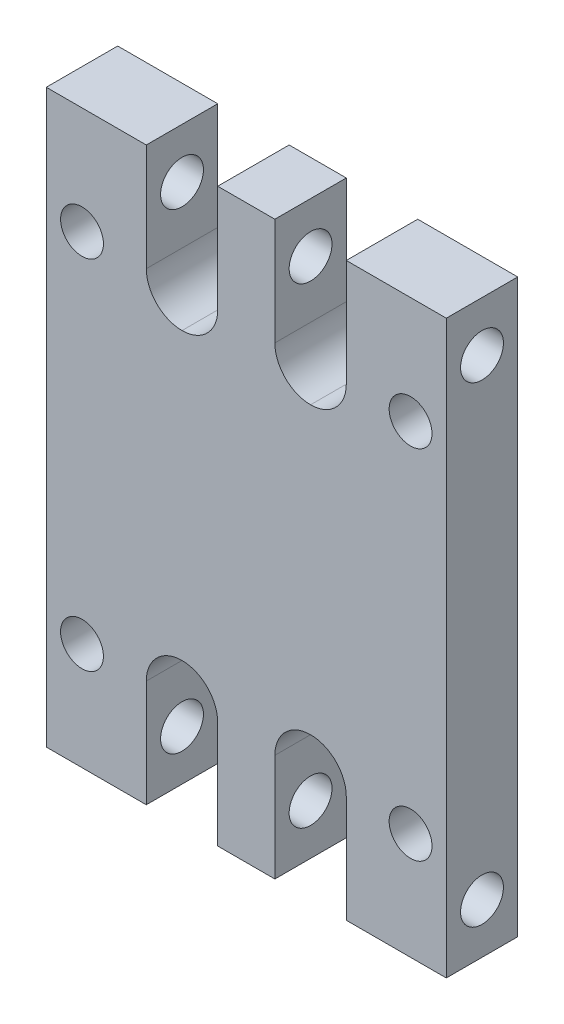
ISO-10303-21;
HEADER;
FILE_DESCRIPTION(('STEP AP214'),'2;1');
FILE_NAME('part.step','',(''),(''),'','','');
FILE_SCHEMA(('AUTOMOTIVE_DESIGN { 1 0 10303 214 1 1 1 1 }'));
ENDSEC;
DATA;
#1=APPLICATION_CONTEXT('core data for automotive mechanical design processes');
#2=APPLICATION_PROTOCOL_DEFINITION('international standard','automotive_design',2000,#1);
#3=PRODUCT_CONTEXT('',#1,'mechanical');
#4=PRODUCT('Part','Part','',(#3));
#5=PRODUCT_RELATED_PRODUCT_CATEGORY('part','',(#4));
#6=PRODUCT_DEFINITION_FORMATION('','',#4);
#7=PRODUCT_DEFINITION_CONTEXT('part definition',#1,'design');
#8=PRODUCT_DEFINITION('design','',#6,#7);
#9=PRODUCT_DEFINITION_SHAPE('','',#8);
#10=(LENGTH_UNIT() NAMED_UNIT(*) SI_UNIT(.MILLI.,.METRE.));
#11=(NAMED_UNIT(*) PLANE_ANGLE_UNIT() SI_UNIT($,.RADIAN.));
#12=(NAMED_UNIT(*) SI_UNIT($,.STERADIAN.) SOLID_ANGLE_UNIT());
#13=UNCERTAINTY_MEASURE_WITH_UNIT(LENGTH_MEASURE(1.E-05),#10,'distance_accuracy_value','');
#14=(GEOMETRIC_REPRESENTATION_CONTEXT(3) GLOBAL_UNCERTAINTY_ASSIGNED_CONTEXT((#13)) GLOBAL_UNIT_ASSIGNED_CONTEXT((#10,
#11,#12)) REPRESENTATION_CONTEXT('',''));
#15=CARTESIAN_POINT('',(0.,0.,0.));
#16=DIRECTION('',(0.,0.,1.));
#17=DIRECTION('',(1.,0.,0.));
#18=AXIS2_PLACEMENT_3D('',#15,#16,#17);
#19=CARTESIAN_POINT('',(0.,0.,5.));
#20=DIRECTION('',(0.,0.,1.));
#21=DIRECTION('',(1.,0.,0.));
#22=AXIS2_PLACEMENT_3D('',#19,#20,#21);
#23=PLANE('',#22);
#24=CARTESIAN_POINT('',(-11.5,12.5,5.));
#25=DIRECTION('',(0.,0.,1.));
#26=DIRECTION('',(1.,0.,0.));
#27=AXIS2_PLACEMENT_3D('',#24,#25,#26);
#28=CIRCLE('',#27,1.5);
#29=CARTESIAN_POINT('',(-10.,12.5,5.));
#30=VERTEX_POINT('',#29);
#31=EDGE_CURVE('E305',#30,#30,#28,.T.);
#32=ORIENTED_EDGE('',*,*,#31,.F.);
#33=EDGE_LOOP('',(#32));
#34=FACE_BOUND('',#33,.T.);
#35=CARTESIAN_POINT('',(11.5,12.5,5.));
#36=DIRECTION('',(0.,0.,1.));
#37=DIRECTION('',(-1.,0.,0.));
#38=AXIS2_PLACEMENT_3D('',#35,#36,#37);
#39=CIRCLE('',#38,1.5);
#40=CARTESIAN_POINT('',(10.,12.5,5.));
#41=VERTEX_POINT('',#40);
#42=EDGE_CURVE('E317',#41,#41,#39,.T.);
#43=ORIENTED_EDGE('',*,*,#42,.F.);
#44=EDGE_LOOP('',(#43));
#45=FACE_BOUND('',#44,.T.);
#46=DIRECTION('',(-1.,0.,0.));
#47=VECTOR('',#46,1.);
#48=CARTESIAN_POINT('',(7.,20.,5.));
#49=LINE('',#48,#47);
#50=CARTESIAN_POINT('',(14.,20.,5.));
#51=VERTEX_POINT('',#50);
#52=CARTESIAN_POINT('',(7.,20.,5.));
#53=VERTEX_POINT('',#52);
#54=EDGE_CURVE('E207',#51,#53,#49,.T.);
#55=ORIENTED_EDGE('',*,*,#54,.T.);
#56=DIRECTION('',(0.,-1.,0.));
#57=VECTOR('',#56,1.);
#58=CARTESIAN_POINT('',(7.,20.,5.));
#59=LINE('',#58,#57);
#60=CARTESIAN_POINT('',(7.,12.5,5.));
#61=VERTEX_POINT('',#60);
#62=EDGE_CURVE('E197',#53,#61,#59,.T.);
#63=ORIENTED_EDGE('',*,*,#62,.T.);
#64=CARTESIAN_POINT('',(4.5,12.5,5.));
#65=DIRECTION('',(0.,0.,1.));
#66=DIRECTION('',(1.,0.,0.));
#67=AXIS2_PLACEMENT_3D('',#64,#65,#66);
#68=CIRCLE('',#67,2.5);
#69=CARTESIAN_POINT('',(4.5,10.,5.));
#70=VERTEX_POINT('',#69);
#71=EDGE_CURVE('E264',#61,#70,#68,.F.);
#72=ORIENTED_EDGE('',*,*,#71,.T.);
#73=CARTESIAN_POINT('',(4.5,12.5,5.));
#74=DIRECTION('',(0.,0.,1.));
#75=DIRECTION('',(1.,0.,0.));
#76=AXIS2_PLACEMENT_3D('',#73,#74,#75);
#77=CIRCLE('',#76,2.5);
#78=CARTESIAN_POINT('',(2.,12.5,5.));
#79=VERTEX_POINT('',#78);
#80=EDGE_CURVE('E268',#70,#79,#77,.F.);
#81=ORIENTED_EDGE('',*,*,#80,.T.);
#82=DIRECTION('',(0.,1.,0.));
#83=VECTOR('',#82,1.);
#84=CARTESIAN_POINT('',(2.,20.,5.));
#85=LINE('',#84,#83);
#86=CARTESIAN_POINT('',(2.,20.,5.));
#87=VERTEX_POINT('',#86);
#88=EDGE_CURVE('E206',#79,#87,#85,.T.);
#89=ORIENTED_EDGE('',*,*,#88,.T.);
#90=DIRECTION('',(-1.,0.,0.));
#91=VECTOR('',#90,1.);
#92=CARTESIAN_POINT('',(-2.,20.,5.));
#93=LINE('',#92,#91);
#94=CARTESIAN_POINT('',(-2.,20.,5.));
#95=VERTEX_POINT('',#94);
#96=EDGE_CURVE('E323',#87,#95,#93,.T.);
#97=ORIENTED_EDGE('',*,*,#96,.T.);
#98=DIRECTION('',(0.,-1.,0.));
#99=VECTOR('',#98,1.);
#100=CARTESIAN_POINT('',(-2.,20.,5.));
#101=LINE('',#100,#99);
#102=CARTESIAN_POINT('',(-2.,12.5,5.));
#103=VERTEX_POINT('',#102);
#104=EDGE_CURVE('E325',#95,#103,#101,.T.);
#105=ORIENTED_EDGE('',*,*,#104,.T.);
#106=CARTESIAN_POINT('',(-4.5,12.5,5.));
#107=DIRECTION('',(0.,0.,1.));
#108=DIRECTION('',(1.,0.,0.));
#109=AXIS2_PLACEMENT_3D('',#106,#107,#108);
#110=CIRCLE('',#109,2.5);
#111=CARTESIAN_POINT('',(-4.5,10.,5.));
#112=VERTEX_POINT('',#111);
#113=EDGE_CURVE('E50',#103,#112,#110,.F.);
#114=ORIENTED_EDGE('',*,*,#113,.T.);
#115=CARTESIAN_POINT('',(-4.5,12.5,5.));
#116=DIRECTION('',(0.,0.,1.));
#117=DIRECTION('',(1.,0.,0.));
#118=AXIS2_PLACEMENT_3D('',#115,#116,#117);
#119=CIRCLE('',#118,2.5);
#120=CARTESIAN_POINT('',(-7.,12.5,5.));
#121=VERTEX_POINT('',#120);
#122=EDGE_CURVE('E11',#112,#121,#119,.F.);
#123=ORIENTED_EDGE('',*,*,#122,.T.);
#124=DIRECTION('',(0.,1.,0.));
#125=VECTOR('',#124,1.);
#126=CARTESIAN_POINT('',(-7.,20.,5.));
#127=LINE('',#126,#125);
#128=CARTESIAN_POINT('',(-7.,20.,5.));
#129=VERTEX_POINT('',#128);
#130=EDGE_CURVE('E327',#121,#129,#127,.T.);
#131=ORIENTED_EDGE('',*,*,#130,.T.);
#132=DIRECTION('',(-1.,0.,0.));
#133=VECTOR('',#132,1.);
#134=CARTESIAN_POINT('',(-14.,20.,5.));
#135=LINE('',#134,#133);
#136=CARTESIAN_POINT('',(-14.,20.,5.));
#137=VERTEX_POINT('',#136);
#138=EDGE_CURVE('E329',#129,#137,#135,.T.);
#139=ORIENTED_EDGE('',*,*,#138,.T.);
#140=DIRECTION('',(0.,-1.,0.));
#141=VECTOR('',#140,1.);
#142=CARTESIAN_POINT('',(-14.,-20.,5.));
#143=LINE('',#142,#141);
#144=CARTESIAN_POINT('',(-14.,-20.,5.));
#145=VERTEX_POINT('',#144);
#146=EDGE_CURVE('E331',#137,#145,#143,.T.);
#147=ORIENTED_EDGE('',*,*,#146,.T.);
#148=DIRECTION('',(1.,0.,0.));
#149=VECTOR('',#148,1.);
#150=CARTESIAN_POINT('',(-14.,-20.,5.));
#151=LINE('',#150,#149);
#152=CARTESIAN_POINT('',(-6.99999999999999,-20.,5.));
#153=VERTEX_POINT('',#152);
#154=EDGE_CURVE('E333',#145,#153,#151,.T.);
#155=ORIENTED_EDGE('',*,*,#154,.T.);
#156=DIRECTION('',(0.,1.,0.));
#157=VECTOR('',#156,1.);
#158=CARTESIAN_POINT('',(-6.99999999999999,-20.,5.));
#159=LINE('',#158,#157);
#160=CARTESIAN_POINT('',(-7.,-12.5,5.));
#161=VERTEX_POINT('',#160);
#162=EDGE_CURVE('E335',#153,#161,#159,.T.);
#163=ORIENTED_EDGE('',*,*,#162,.T.);
#164=CARTESIAN_POINT('',(-4.5,-12.5,5.));
#165=DIRECTION('',(0.,0.,1.));
#166=DIRECTION('',(1.,0.,0.));
#167=AXIS2_PLACEMENT_3D('',#164,#165,#166);
#168=CIRCLE('',#167,2.5);
#169=CARTESIAN_POINT('',(-4.5,-10.,5.));
#170=VERTEX_POINT('',#169);
#171=EDGE_CURVE('E260',#161,#170,#168,.F.);
#172=ORIENTED_EDGE('',*,*,#171,.T.);
#173=CARTESIAN_POINT('',(-4.5,-12.5,5.));
#174=DIRECTION('',(0.,0.,1.));
#175=DIRECTION('',(1.,0.,0.));
#176=AXIS2_PLACEMENT_3D('',#173,#174,#175);
#177=CIRCLE('',#176,2.5);
#178=CARTESIAN_POINT('',(-2.,-12.5,5.));
#179=VERTEX_POINT('',#178);
#180=EDGE_CURVE('E256',#170,#179,#177,.F.);
#181=ORIENTED_EDGE('',*,*,#180,.T.);
#182=DIRECTION('',(0.,-1.,0.));
#183=VECTOR('',#182,1.);
#184=CARTESIAN_POINT('',(-2.,-20.,5.));
#185=LINE('',#184,#183);
#186=CARTESIAN_POINT('',(-2.,-20.,5.));
#187=VERTEX_POINT('',#186);
#188=EDGE_CURVE('E338',#179,#187,#185,.T.);
#189=ORIENTED_EDGE('',*,*,#188,.T.);
#190=DIRECTION('',(1.,0.,0.));
#191=VECTOR('',#190,1.);
#192=CARTESIAN_POINT('',(-2.,-20.,5.));
#193=LINE('',#192,#191);
#194=CARTESIAN_POINT('',(2.00000000000001,-20.,5.));
#195=VERTEX_POINT('',#194);
#196=EDGE_CURVE('E340',#187,#195,#193,.T.);
#197=ORIENTED_EDGE('',*,*,#196,.T.);
#198=DIRECTION('',(0.,1.,0.));
#199=VECTOR('',#198,1.);
#200=CARTESIAN_POINT('',(2.00000000000001,-20.,5.));
#201=LINE('',#200,#199);
#202=CARTESIAN_POINT('',(2.,-12.5,5.));
#203=VERTEX_POINT('',#202);
#204=EDGE_CURVE('E342',#195,#203,#201,.T.);
#205=ORIENTED_EDGE('',*,*,#204,.T.);
#206=CARTESIAN_POINT('',(4.5,-12.5,5.));
#207=DIRECTION('',(0.,0.,1.));
#208=DIRECTION('',(1.,0.,0.));
#209=AXIS2_PLACEMENT_3D('',#206,#207,#208);
#210=CIRCLE('',#209,2.5);
#211=CARTESIAN_POINT('',(4.5,-10.,5.));
#212=VERTEX_POINT('',#211);
#213=EDGE_CURVE('E252',#203,#212,#210,.F.);
#214=ORIENTED_EDGE('',*,*,#213,.T.);
#215=CARTESIAN_POINT('',(4.5,-12.5,5.));
#216=DIRECTION('',(0.,0.,1.));
#217=DIRECTION('',(1.,0.,0.));
#218=AXIS2_PLACEMENT_3D('',#215,#216,#217);
#219=CIRCLE('',#218,2.5);
#220=CARTESIAN_POINT('',(7.,-12.5,5.));
#221=VERTEX_POINT('',#220);
#222=EDGE_CURVE('E248',#212,#221,#219,.F.);
#223=ORIENTED_EDGE('',*,*,#222,.T.);
#224=DIRECTION('',(0.,-1.,0.));
#225=VECTOR('',#224,1.);
#226=CARTESIAN_POINT('',(7.00000000000001,-20.,5.));
#227=LINE('',#226,#225);
#228=CARTESIAN_POINT('',(7.00000000000001,-20.,5.));
#229=VERTEX_POINT('',#228);
#230=EDGE_CURVE('E345',#221,#229,#227,.T.);
#231=ORIENTED_EDGE('',*,*,#230,.T.);
#232=DIRECTION('',(1.,0.,0.));
#233=VECTOR('',#232,1.);
#234=CARTESIAN_POINT('',(7.00000000000001,-20.,5.));
#235=LINE('',#234,#233);
#236=CARTESIAN_POINT('',(14.,-20.,5.));
#237=VERTEX_POINT('',#236);
#238=EDGE_CURVE('E347',#229,#237,#235,.T.);
#239=ORIENTED_EDGE('',*,*,#238,.T.);
#240=DIRECTION('',(0.,1.,0.));
#241=VECTOR('',#240,1.);
#242=CARTESIAN_POINT('',(14.,-20.,5.));
#243=LINE('',#242,#241);
#244=EDGE_CURVE('E212',#237,#51,#243,.T.);
#245=ORIENTED_EDGE('',*,*,#244,.T.);
#246=EDGE_LOOP('',(#55,#63,#72,#81,#89,#97,#105,#114,#123,#131,#139,#147,#155,#163,#172,#181,
#189,#197,#205,#214,#223,#231,#239,#245));
#247=FACE_BOUND('',#246,.T.);
#248=CARTESIAN_POINT('',(11.5,-12.5,5.));
#249=DIRECTION('',(0.,0.,1.));
#250=DIRECTION('',(1.,0.,0.));
#251=AXIS2_PLACEMENT_3D('',#248,#249,#250);
#252=CIRCLE('',#251,1.5);
#253=CARTESIAN_POINT('',(13.,-12.5,5.));
#254=VERTEX_POINT('',#253);
#255=EDGE_CURVE('E311',#254,#254,#252,.T.);
#256=ORIENTED_EDGE('',*,*,#255,.F.);
#257=EDGE_LOOP('',(#256));
#258=FACE_BOUND('',#257,.T.);
#259=CARTESIAN_POINT('',(-11.5,-12.5,5.));
#260=DIRECTION('',(0.,0.,1.));
#261=DIRECTION('',(-1.,0.,0.));
#262=AXIS2_PLACEMENT_3D('',#259,#260,#261);
#263=CIRCLE('',#262,1.5);
#264=CARTESIAN_POINT('',(-13.,-12.5,5.));
#265=VERTEX_POINT('',#264);
#266=EDGE_CURVE('E299',#265,#265,#263,.T.);
#267=ORIENTED_EDGE('',*,*,#266,.F.);
#268=EDGE_LOOP('',(#267));
#269=FACE_BOUND('',#268,.T.);
#270=ADVANCED_FACE('F34',(#34,#45,#247,#258,#269),#23,.T.);
#271=CARTESIAN_POINT('',(0.,0.,0.));
#272=DIRECTION('',(0.,0.,1.));
#273=DIRECTION('',(1.,0.,0.));
#274=AXIS2_PLACEMENT_3D('',#271,#272,#273);
#275=PLANE('',#274);
#276=DIRECTION('',(-1.,0.,0.));
#277=VECTOR('',#276,1.);
#278=CARTESIAN_POINT('',(7.,20.,0.));
#279=LINE('',#278,#277);
#280=CARTESIAN_POINT('',(14.,20.,0.));
#281=VERTEX_POINT('',#280);
#282=CARTESIAN_POINT('',(7.,20.,0.));
#283=VERTEX_POINT('',#282);
#284=EDGE_CURVE('E220',#281,#283,#279,.T.);
#285=ORIENTED_EDGE('',*,*,#284,.F.);
#286=DIRECTION('',(0.,1.,0.));
#287=VECTOR('',#286,1.);
#288=CARTESIAN_POINT('',(14.,-20.,0.));
#289=LINE('',#288,#287);
#290=CARTESIAN_POINT('',(14.,-20.,0.));
#291=VERTEX_POINT('',#290);
#292=EDGE_CURVE('E216',#291,#281,#289,.T.);
#293=ORIENTED_EDGE('',*,*,#292,.F.);
#294=DIRECTION('',(1.,0.,0.));
#295=VECTOR('',#294,1.);
#296=CARTESIAN_POINT('',(7.00000000000001,-20.,0.));
#297=LINE('',#296,#295);
#298=CARTESIAN_POINT('',(7.00000000000001,-20.,0.));
#299=VERTEX_POINT('',#298);
#300=EDGE_CURVE('E381',#299,#291,#297,.T.);
#301=ORIENTED_EDGE('',*,*,#300,.F.);
#302=DIRECTION('',(0.,-1.,0.));
#303=VECTOR('',#302,1.);
#304=CARTESIAN_POINT('',(7.00000000000001,-20.,0.));
#305=LINE('',#304,#303);
#306=CARTESIAN_POINT('',(7.,-12.5,0.));
#307=VERTEX_POINT('',#306);
#308=EDGE_CURVE('E379',#307,#299,#305,.T.);
#309=ORIENTED_EDGE('',*,*,#308,.F.);
#310=CARTESIAN_POINT('',(4.5,-12.5,0.));
#311=DIRECTION('',(0.,0.,1.));
#312=DIRECTION('',(1.,0.,0.));
#313=AXIS2_PLACEMENT_3D('',#310,#311,#312);
#314=CIRCLE('',#313,2.5);
#315=CARTESIAN_POINT('',(4.5,-10.,0.));
#316=VERTEX_POINT('',#315);
#317=EDGE_CURVE('E246',#307,#316,#314,.T.);
#318=ORIENTED_EDGE('',*,*,#317,.T.);
#319=CARTESIAN_POINT('',(4.5,-12.5,0.));
#320=DIRECTION('',(0.,0.,1.));
#321=DIRECTION('',(1.,0.,0.));
#322=AXIS2_PLACEMENT_3D('',#319,#320,#321);
#323=CIRCLE('',#322,2.5);
#324=CARTESIAN_POINT('',(2.,-12.5,0.));
#325=VERTEX_POINT('',#324);
#326=EDGE_CURVE('E250',#316,#325,#323,.T.);
#327=ORIENTED_EDGE('',*,*,#326,.T.);
#328=DIRECTION('',(0.,1.,0.));
#329=VECTOR('',#328,1.);
#330=CARTESIAN_POINT('',(2.00000000000001,-20.,0.));
#331=LINE('',#330,#329);
#332=CARTESIAN_POINT('',(2.00000000000001,-20.,0.));
#333=VERTEX_POINT('',#332);
#334=EDGE_CURVE('E376',#333,#325,#331,.T.);
#335=ORIENTED_EDGE('',*,*,#334,.F.);
#336=DIRECTION('',(1.,0.,0.));
#337=VECTOR('',#336,1.);
#338=CARTESIAN_POINT('',(-2.,-20.,0.));
#339=LINE('',#338,#337);
#340=CARTESIAN_POINT('',(-2.,-20.,0.));
#341=VERTEX_POINT('',#340);
#342=EDGE_CURVE('E374',#341,#333,#339,.T.);
#343=ORIENTED_EDGE('',*,*,#342,.F.);
#344=DIRECTION('',(0.,-1.,0.));
#345=VECTOR('',#344,1.);
#346=CARTESIAN_POINT('',(-2.,-20.,0.));
#347=LINE('',#346,#345);
#348=CARTESIAN_POINT('',(-2.,-12.5,0.));
#349=VERTEX_POINT('',#348);
#350=EDGE_CURVE('E372',#349,#341,#347,.T.);
#351=ORIENTED_EDGE('',*,*,#350,.F.);
#352=CARTESIAN_POINT('',(-4.5,-12.5,0.));
#353=DIRECTION('',(0.,0.,1.));
#354=DIRECTION('',(1.,0.,0.));
#355=AXIS2_PLACEMENT_3D('',#352,#353,#354);
#356=CIRCLE('',#355,2.5);
#357=CARTESIAN_POINT('',(-4.5,-10.,0.));
#358=VERTEX_POINT('',#357);
#359=EDGE_CURVE('E254',#349,#358,#356,.T.);
#360=ORIENTED_EDGE('',*,*,#359,.T.);
#361=CARTESIAN_POINT('',(-4.5,-12.5,0.));
#362=DIRECTION('',(0.,0.,1.));
#363=DIRECTION('',(1.,0.,0.));
#364=AXIS2_PLACEMENT_3D('',#361,#362,#363);
#365=CIRCLE('',#364,2.5);
#366=CARTESIAN_POINT('',(-7.,-12.5,0.));
#367=VERTEX_POINT('',#366);
#368=EDGE_CURVE('E258',#358,#367,#365,.T.);
#369=ORIENTED_EDGE('',*,*,#368,.T.);
#370=DIRECTION('',(0.,1.,0.));
#371=VECTOR('',#370,1.);
#372=CARTESIAN_POINT('',(-6.99999999999999,-20.,0.));
#373=LINE('',#372,#371);
#374=CARTESIAN_POINT('',(-6.99999999999999,-20.,0.));
#375=VERTEX_POINT('',#374);
#376=EDGE_CURVE('E369',#375,#367,#373,.T.);
#377=ORIENTED_EDGE('',*,*,#376,.F.);
#378=DIRECTION('',(1.,0.,0.));
#379=VECTOR('',#378,1.);
#380=CARTESIAN_POINT('',(-14.,-20.,0.));
#381=LINE('',#380,#379);
#382=CARTESIAN_POINT('',(-14.,-20.,0.));
#383=VERTEX_POINT('',#382);
#384=EDGE_CURVE('E367',#383,#375,#381,.T.);
#385=ORIENTED_EDGE('',*,*,#384,.F.);
#386=DIRECTION('',(0.,-1.,0.));
#387=VECTOR('',#386,1.);
#388=CARTESIAN_POINT('',(-14.,-20.,0.));
#389=LINE('',#388,#387);
#390=CARTESIAN_POINT('',(-14.,20.,0.));
#391=VERTEX_POINT('',#390);
#392=EDGE_CURVE('E365',#391,#383,#389,.T.);
#393=ORIENTED_EDGE('',*,*,#392,.F.);
#394=DIRECTION('',(-1.,0.,0.));
#395=VECTOR('',#394,1.);
#396=CARTESIAN_POINT('',(-14.,20.,0.));
#397=LINE('',#396,#395);
#398=CARTESIAN_POINT('',(-7.,20.,0.));
#399=VERTEX_POINT('',#398);
#400=EDGE_CURVE('E363',#399,#391,#397,.T.);
#401=ORIENTED_EDGE('',*,*,#400,.F.);
#402=DIRECTION('',(0.,1.,0.));
#403=VECTOR('',#402,1.);
#404=CARTESIAN_POINT('',(-7.,20.,0.));
#405=LINE('',#404,#403);
#406=CARTESIAN_POINT('',(-7.,12.5,0.));
#407=VERTEX_POINT('',#406);
#408=EDGE_CURVE('E361',#407,#399,#405,.T.);
#409=ORIENTED_EDGE('',*,*,#408,.F.);
#410=CARTESIAN_POINT('',(-4.5,12.5,0.));
#411=DIRECTION('',(0.,0.,1.));
#412=DIRECTION('',(1.,0.,0.));
#413=AXIS2_PLACEMENT_3D('',#410,#411,#412);
#414=CIRCLE('',#413,2.5);
#415=CARTESIAN_POINT('',(-4.5,10.,0.));
#416=VERTEX_POINT('',#415);
#417=EDGE_CURVE('E43',#407,#416,#414,.T.);
#418=ORIENTED_EDGE('',*,*,#417,.T.);
#419=CARTESIAN_POINT('',(-4.5,12.5,0.));
#420=DIRECTION('',(0.,0.,1.));
#421=DIRECTION('',(1.,0.,0.));
#422=AXIS2_PLACEMENT_3D('',#419,#420,#421);
#423=CIRCLE('',#422,2.5);
#424=CARTESIAN_POINT('',(-2.,12.5,0.));
#425=VERTEX_POINT('',#424);
#426=EDGE_CURVE('E270',#416,#425,#423,.T.);
#427=ORIENTED_EDGE('',*,*,#426,.T.);
#428=DIRECTION('',(0.,-1.,0.));
#429=VECTOR('',#428,1.);
#430=CARTESIAN_POINT('',(-2.,20.,0.));
#431=LINE('',#430,#429);
#432=CARTESIAN_POINT('',(-2.,20.,0.));
#433=VERTEX_POINT('',#432);
#434=EDGE_CURVE('E358',#433,#425,#431,.T.);
#435=ORIENTED_EDGE('',*,*,#434,.F.);
#436=DIRECTION('',(-1.,0.,0.));
#437=VECTOR('',#436,1.);
#438=CARTESIAN_POINT('',(-2.,20.,0.));
#439=LINE('',#438,#437);
#440=CARTESIAN_POINT('',(2.,20.,0.));
#441=VERTEX_POINT('',#440);
#442=EDGE_CURVE('E356',#441,#433,#439,.T.);
#443=ORIENTED_EDGE('',*,*,#442,.F.);
#444=DIRECTION('',(0.,1.,0.));
#445=VECTOR('',#444,1.);
#446=CARTESIAN_POINT('',(2.,20.,0.));
#447=LINE('',#446,#445);
#448=CARTESIAN_POINT('',(2.,12.5,0.));
#449=VERTEX_POINT('',#448);
#450=EDGE_CURVE('E354',#449,#441,#447,.T.);
#451=ORIENTED_EDGE('',*,*,#450,.F.);
#452=CARTESIAN_POINT('',(4.5,12.5,0.));
#453=DIRECTION('',(0.,0.,1.));
#454=DIRECTION('',(1.,0.,0.));
#455=AXIS2_PLACEMENT_3D('',#452,#453,#454);
#456=CIRCLE('',#455,2.5);
#457=CARTESIAN_POINT('',(4.5,10.,0.));
#458=VERTEX_POINT('',#457);
#459=EDGE_CURVE('E266',#449,#458,#456,.T.);
#460=ORIENTED_EDGE('',*,*,#459,.T.);
#461=CARTESIAN_POINT('',(4.5,12.5,0.));
#462=DIRECTION('',(0.,0.,1.));
#463=DIRECTION('',(1.,0.,0.));
#464=AXIS2_PLACEMENT_3D('',#461,#462,#463);
#465=CIRCLE('',#464,2.5);
#466=CARTESIAN_POINT('',(7.,12.5,0.));
#467=VERTEX_POINT('',#466);
#468=EDGE_CURVE('E262',#458,#467,#465,.T.);
#469=ORIENTED_EDGE('',*,*,#468,.T.);
#470=DIRECTION('',(0.,-1.,0.));
#471=VECTOR('',#470,1.);
#472=CARTESIAN_POINT('',(7.,20.,0.));
#473=LINE('',#472,#471);
#474=EDGE_CURVE('E352',#283,#467,#473,.T.);
#475=ORIENTED_EDGE('',*,*,#474,.F.);
#476=EDGE_LOOP('',(#285,#293,#301,#309,#318,#327,#335,#343,#351,#360,#369,#377,#385,#393,#401,
#409,#418,#427,#435,#443,#451,#460,#469,#475));
#477=FACE_BOUND('',#476,.T.);
#478=CARTESIAN_POINT('',(11.5,12.5,0.));
#479=DIRECTION('',(0.,0.,1.));
#480=DIRECTION('',(-1.,0.,0.));
#481=AXIS2_PLACEMENT_3D('',#478,#479,#480);
#482=CIRCLE('',#481,1.5);
#483=CARTESIAN_POINT('',(10.,12.5,0.));
#484=VERTEX_POINT('',#483);
#485=EDGE_CURVE('E314',#484,#484,#482,.T.);
#486=ORIENTED_EDGE('',*,*,#485,.T.);
#487=EDGE_LOOP('',(#486));
#488=FACE_BOUND('',#487,.T.);
#489=CARTESIAN_POINT('',(11.5,-12.5,0.));
#490=DIRECTION('',(0.,0.,1.));
#491=DIRECTION('',(1.,0.,0.));
#492=AXIS2_PLACEMENT_3D('',#489,#490,#491);
#493=CIRCLE('',#492,1.5);
#494=CARTESIAN_POINT('',(13.,-12.5,0.));
#495=VERTEX_POINT('',#494);
#496=EDGE_CURVE('E308',#495,#495,#493,.T.);
#497=ORIENTED_EDGE('',*,*,#496,.T.);
#498=EDGE_LOOP('',(#497));
#499=FACE_BOUND('',#498,.T.);
#500=CARTESIAN_POINT('',(-11.5,12.5,0.));
#501=DIRECTION('',(0.,0.,1.));
#502=DIRECTION('',(1.,0.,0.));
#503=AXIS2_PLACEMENT_3D('',#500,#501,#502);
#504=CIRCLE('',#503,1.5);
#505=CARTESIAN_POINT('',(-10.,12.5,0.));
#506=VERTEX_POINT('',#505);
#507=EDGE_CURVE('E302',#506,#506,#504,.T.);
#508=ORIENTED_EDGE('',*,*,#507,.T.);
#509=EDGE_LOOP('',(#508));
#510=FACE_BOUND('',#509,.T.);
#511=CARTESIAN_POINT('',(-11.5,-12.5,0.));
#512=DIRECTION('',(0.,0.,1.));
#513=DIRECTION('',(-1.,0.,0.));
#514=AXIS2_PLACEMENT_3D('',#511,#512,#513);
#515=CIRCLE('',#514,1.5);
#516=CARTESIAN_POINT('',(-13.,-12.5,0.));
#517=VERTEX_POINT('',#516);
#518=EDGE_CURVE('E277',#517,#517,#515,.T.);
#519=ORIENTED_EDGE('',*,*,#518,.T.);
#520=EDGE_LOOP('',(#519));
#521=FACE_BOUND('',#520,.T.);
#522=ADVANCED_FACE('F418',(#477,#488,#499,#510,#521),#275,.F.);
#523=CARTESIAN_POINT('',(7.,20.,5.));
#524=DIRECTION('',(0.,-1.,0.));
#525=DIRECTION('',(1.,0.,0.));
#526=AXIS2_PLACEMENT_3D('',#523,#524,#525);
#527=PLANE('',#526);
#528=ORIENTED_EDGE('',*,*,#284,.T.);
#529=DIRECTION('',(0.,0.,-1.));
#530=VECTOR('',#529,1.);
#531=CARTESIAN_POINT('',(7.,20.,5.));
#532=LINE('',#531,#530);
#533=EDGE_CURVE('E202',#53,#283,#532,.T.);
#534=ORIENTED_EDGE('',*,*,#533,.F.);
#535=ORIENTED_EDGE('',*,*,#54,.F.);
#536=DIRECTION('',(0.,0.,-1.));
#537=VECTOR('',#536,1.);
#538=CARTESIAN_POINT('',(14.,20.,5.));
#539=LINE('',#538,#537);
#540=EDGE_CURVE('E350',#51,#281,#539,.T.);
#541=ORIENTED_EDGE('',*,*,#540,.T.);
#542=EDGE_LOOP('',(#528,#534,#535,#541));
#543=FACE_BOUND('',#542,.T.);
#544=ADVANCED_FACE('F218',(#543),#527,.F.);
#545=CARTESIAN_POINT('',(7.,20.,5.));
#546=DIRECTION('',(1.,0.,0.));
#547=DIRECTION('',(0.,1.,0.));
#548=AXIS2_PLACEMENT_3D('',#545,#546,#547);
#549=PLANE('',#548);
#550=CARTESIAN_POINT('',(7.,16.5,2.5));
#551=DIRECTION('',(1.,0.,0.));
#552=DIRECTION('',(0.,1.,0.));
#553=AXIS2_PLACEMENT_3D('',#550,#551,#552);
#554=CIRCLE('',#553,1.5);
#555=CARTESIAN_POINT('',(7.,18.,2.5));
#556=VERTEX_POINT('',#555);
#557=EDGE_CURVE('E286',#556,#556,#554,.T.);
#558=ORIENTED_EDGE('',*,*,#557,.T.);
#559=EDGE_LOOP('',(#558));
#560=FACE_BOUND('',#559,.T.);
#561=ORIENTED_EDGE('',*,*,#474,.T.);
#562=DIRECTION('',(0.,0.,-1.));
#563=VECTOR('',#562,1.);
#564=CARTESIAN_POINT('',(7.,12.5,5.));
#565=LINE('',#564,#563);
#566=EDGE_CURVE('E205',#467,#61,#565,.F.);
#567=ORIENTED_EDGE('',*,*,#566,.T.);
#568=ORIENTED_EDGE('',*,*,#62,.F.);
#569=ORIENTED_EDGE('',*,*,#533,.T.);
#570=EDGE_LOOP('',(#561,#567,#568,#569));
#571=FACE_BOUND('',#570,.T.);
#572=ADVANCED_FACE('F200',(#560,#571),#549,.F.);
#573=CARTESIAN_POINT('',(2.,20.,5.));
#574=DIRECTION('',(-1.,0.,0.));
#575=DIRECTION('',(0.,-1.,0.));
#576=AXIS2_PLACEMENT_3D('',#573,#574,#575);
#577=PLANE('',#576);
#578=CARTESIAN_POINT('',(2.,16.5,2.5));
#579=DIRECTION('',(-1.,0.,0.));
#580=DIRECTION('',(0.,-1.,0.));
#581=AXIS2_PLACEMENT_3D('',#578,#579,#580);
#582=CIRCLE('',#581,1.5);
#583=CARTESIAN_POINT('',(2.,15.,2.5));
#584=VERTEX_POINT('',#583);
#585=EDGE_CURVE('E290',#584,#584,#582,.T.);
#586=ORIENTED_EDGE('',*,*,#585,.T.);
#587=EDGE_LOOP('',(#586));
#588=FACE_BOUND('',#587,.T.);
#589=ORIENTED_EDGE('',*,*,#88,.F.);
#590=DIRECTION('',(0.,0.,-1.));
#591=VECTOR('',#590,1.);
#592=CARTESIAN_POINT('',(2.,12.5,0.));
#593=LINE('',#592,#591);
#594=EDGE_CURVE('E239',#79,#449,#593,.T.);
#595=ORIENTED_EDGE('',*,*,#594,.T.);
#596=ORIENTED_EDGE('',*,*,#450,.T.);
#597=DIRECTION('',(0.,0.,-1.));
#598=VECTOR('',#597,1.);
#599=CARTESIAN_POINT('',(2.,20.,5.));
#600=LINE('',#599,#598);
#601=EDGE_CURVE('E222',#87,#441,#600,.T.);
#602=ORIENTED_EDGE('',*,*,#601,.F.);
#603=EDGE_LOOP('',(#589,#595,#596,#602));
#604=FACE_BOUND('',#603,.T.);
#605=ADVANCED_FACE('F426',(#588,#604),#577,.F.);
#606=CARTESIAN_POINT('',(-2.,20.,5.));
#607=DIRECTION('',(0.,-1.,0.));
#608=DIRECTION('',(0.,0.,-1.));
#609=AXIS2_PLACEMENT_3D('',#606,#607,#608);
#610=PLANE('',#609);
#611=ORIENTED_EDGE('',*,*,#442,.T.);
#612=DIRECTION('',(0.,0.,-1.));
#613=VECTOR('',#612,1.);
#614=CARTESIAN_POINT('',(-2.,20.,5.));
#615=LINE('',#614,#613);
#616=EDGE_CURVE('E228',#95,#433,#615,.T.);
#617=ORIENTED_EDGE('',*,*,#616,.F.);
#618=ORIENTED_EDGE('',*,*,#96,.F.);
#619=ORIENTED_EDGE('',*,*,#601,.T.);
#620=EDGE_LOOP('',(#611,#617,#618,#619));
#621=FACE_BOUND('',#620,.T.);
#622=ADVANCED_FACE('F424',(#621),#610,.F.);
#623=CARTESIAN_POINT('',(-2.,20.,5.));
#624=DIRECTION('',(1.,0.,0.));
#625=DIRECTION('',(0.,1.,0.));
#626=AXIS2_PLACEMENT_3D('',#623,#624,#625);
#627=PLANE('',#626);
#628=CARTESIAN_POINT('',(-2.,16.5,2.5));
#629=DIRECTION('',(1.,0.,0.));
#630=DIRECTION('',(0.,1.,0.));
#631=AXIS2_PLACEMENT_3D('',#628,#629,#630);
#632=CIRCLE('',#631,1.5);
#633=CARTESIAN_POINT('',(-2.,18.,2.5));
#634=VERTEX_POINT('',#633);
#635=EDGE_CURVE('E295',#634,#634,#632,.T.);
#636=ORIENTED_EDGE('',*,*,#635,.T.);
#637=EDGE_LOOP('',(#636));
#638=FACE_BOUND('',#637,.T.);
#639=ORIENTED_EDGE('',*,*,#434,.T.);
#640=DIRECTION('',(0.,0.,-1.));
#641=VECTOR('',#640,1.);
#642=CARTESIAN_POINT('',(-2.,12.5,5.));
#643=LINE('',#642,#641);
#644=EDGE_CURVE('E241',#425,#103,#643,.F.);
#645=ORIENTED_EDGE('',*,*,#644,.T.);
#646=ORIENTED_EDGE('',*,*,#104,.F.);
#647=ORIENTED_EDGE('',*,*,#616,.T.);
#648=EDGE_LOOP('',(#639,#645,#646,#647));
#649=FACE_BOUND('',#648,.T.);
#650=ADVANCED_FACE('F413',(#638,#649),#627,.F.);
#651=CARTESIAN_POINT('',(-7.,20.,5.));
#652=DIRECTION('',(-1.,0.,0.));
#653=DIRECTION('',(0.,-1.,0.));
#654=AXIS2_PLACEMENT_3D('',#651,#652,#653);
#655=PLANE('',#654);
#656=CARTESIAN_POINT('',(-7.,16.5,2.5));
#657=DIRECTION('',(-1.,0.,0.));
#658=DIRECTION('',(0.,-1.,0.));
#659=AXIS2_PLACEMENT_3D('',#656,#657,#658);
#660=CIRCLE('',#659,1.5);
#661=CARTESIAN_POINT('',(-7.,15.,2.5));
#662=VERTEX_POINT('',#661);
#663=EDGE_CURVE('E838',#662,#662,#660,.T.);
#664=ORIENTED_EDGE('',*,*,#663,.T.);
#665=EDGE_LOOP('',(#664));
#666=FACE_BOUND('',#665,.T.);
#667=ORIENTED_EDGE('',*,*,#130,.F.);
#668=DIRECTION('',(0.,0.,-1.));
#669=VECTOR('',#668,1.);
#670=CARTESIAN_POINT('',(-7.,12.5,0.));
#671=LINE('',#670,#669);
#672=EDGE_CURVE('E244',#121,#407,#671,.T.);
#673=ORIENTED_EDGE('',*,*,#672,.T.);
#674=ORIENTED_EDGE('',*,*,#408,.T.);
#675=DIRECTION('',(0.,0.,-1.));
#676=VECTOR('',#675,1.);
#677=CARTESIAN_POINT('',(-7.,20.,5.));
#678=LINE('',#677,#676);
#679=EDGE_CURVE('E406',#129,#399,#678,.T.);
#680=ORIENTED_EDGE('',*,*,#679,.F.);
#681=EDGE_LOOP('',(#667,#673,#674,#680));
#682=FACE_BOUND('',#681,.T.);
#683=ADVANCED_FACE('F502',(#666,#682),#655,.F.);
#684=CARTESIAN_POINT('',(-14.,20.,5.));
#685=DIRECTION('',(0.,-1.,0.));
#686=DIRECTION('',(0.,0.,-1.));
#687=AXIS2_PLACEMENT_3D('',#684,#685,#686);
#688=PLANE('',#687);
#689=ORIENTED_EDGE('',*,*,#400,.T.);
#690=DIRECTION('',(0.,0.,-1.));
#691=VECTOR('',#690,1.);
#692=CARTESIAN_POINT('',(-14.,20.,5.));
#693=LINE('',#692,#691);
#694=EDGE_CURVE('E403',#137,#391,#693,.T.);
#695=ORIENTED_EDGE('',*,*,#694,.F.);
#696=ORIENTED_EDGE('',*,*,#138,.F.);
#697=ORIENTED_EDGE('',*,*,#679,.T.);
#698=EDGE_LOOP('',(#689,#695,#696,#697));
#699=FACE_BOUND('',#698,.T.);
#700=ADVANCED_FACE('F498',(#699),#688,.F.);
#701=CARTESIAN_POINT('',(-14.,-20.,5.));
#702=DIRECTION('',(1.,0.,0.));
#703=DIRECTION('',(0.,0.,-1.));
#704=AXIS2_PLACEMENT_3D('',#701,#702,#703);
#705=PLANE('',#704);
#706=CARTESIAN_POINT('',(-14.,16.5,2.5));
#707=DIRECTION('',(1.,0.,0.));
#708=DIRECTION('',(0.,0.,-1.));
#709=AXIS2_PLACEMENT_3D('',#706,#707,#708);
#710=CIRCLE('',#709,1.5);
#711=CARTESIAN_POINT('',(-14.,16.5,0.999999999999999));
#712=VERTEX_POINT('',#711);
#713=EDGE_CURVE('E840',#712,#712,#710,.T.);
#714=ORIENTED_EDGE('',*,*,#713,.T.);
#715=EDGE_LOOP('',(#714));
#716=FACE_BOUND('',#715,.T.);
#717=CARTESIAN_POINT('',(-14.,-16.5,2.5));
#718=DIRECTION('',(1.,0.,0.));
#719=DIRECTION('',(0.,0.,-1.));
#720=AXIS2_PLACEMENT_3D('',#717,#718,#719);
#721=CIRCLE('',#720,1.5);
#722=CARTESIAN_POINT('',(-14.,-16.5,0.999999999999995));
#723=VERTEX_POINT('',#722);
#724=EDGE_CURVE('E845',#723,#723,#721,.T.);
#725=ORIENTED_EDGE('',*,*,#724,.T.);
#726=EDGE_LOOP('',(#725));
#727=FACE_BOUND('',#726,.T.);
#728=ORIENTED_EDGE('',*,*,#392,.T.);
#729=DIRECTION('',(0.,0.,-1.));
#730=VECTOR('',#729,1.);
#731=CARTESIAN_POINT('',(-14.,-20.,5.));
#732=LINE('',#731,#730);
#733=EDGE_CURVE('E400',#145,#383,#732,.T.);
#734=ORIENTED_EDGE('',*,*,#733,.F.);
#735=ORIENTED_EDGE('',*,*,#146,.F.);
#736=ORIENTED_EDGE('',*,*,#694,.T.);
#737=EDGE_LOOP('',(#728,#734,#735,#736));
#738=FACE_BOUND('',#737,.T.);
#739=ADVANCED_FACE('F494',(#716,#727,#738),#705,.F.);
#740=CARTESIAN_POINT('',(-14.,-20.,5.));
#741=DIRECTION('',(0.,1.,0.));
#742=DIRECTION('',(0.,0.,1.));
#743=AXIS2_PLACEMENT_3D('',#740,#741,#742);
#744=PLANE('',#743);
#745=ORIENTED_EDGE('',*,*,#384,.T.);
#746=DIRECTION('',(0.,0.,-1.));
#747=VECTOR('',#746,1.);
#748=CARTESIAN_POINT('',(-6.99999999999999,-20.,5.));
#749=LINE('',#748,#747);
#750=EDGE_CURVE('E397',#153,#375,#749,.T.);
#751=ORIENTED_EDGE('',*,*,#750,.F.);
#752=ORIENTED_EDGE('',*,*,#154,.F.);
#753=ORIENTED_EDGE('',*,*,#733,.T.);
#754=EDGE_LOOP('',(#745,#751,#752,#753));
#755=FACE_BOUND('',#754,.T.);
#756=ADVANCED_FACE('F489',(#755),#744,.F.);
#757=CARTESIAN_POINT('',(-6.99999999999999,-20.,5.));
#758=DIRECTION('',(-1.,0.,0.));
#759=DIRECTION('',(0.,-1.,0.));
#760=AXIS2_PLACEMENT_3D('',#757,#758,#759);
#761=PLANE('',#760);
#762=CARTESIAN_POINT('',(-7.,-16.5,2.5));
#763=DIRECTION('',(-1.,0.,0.));
#764=DIRECTION('',(0.,-1.,0.));
#765=AXIS2_PLACEMENT_3D('',#762,#763,#764);
#766=CIRCLE('',#765,1.5);
#767=CARTESIAN_POINT('',(-6.99999999999999,-18.,2.5));
#768=VERTEX_POINT('',#767);
#769=EDGE_CURVE('E848',#768,#768,#766,.T.);
#770=ORIENTED_EDGE('',*,*,#769,.T.);
#771=EDGE_LOOP('',(#770));
#772=FACE_BOUND('',#771,.T.);
#773=ORIENTED_EDGE('',*,*,#376,.T.);
#774=DIRECTION('',(0.,0.,-1.));
#775=VECTOR('',#774,1.);
#776=CARTESIAN_POINT('',(-7.,-12.5,5.));
#777=LINE('',#776,#775);
#778=EDGE_CURVE('E236',#367,#161,#777,.F.);
#779=ORIENTED_EDGE('',*,*,#778,.T.);
#780=ORIENTED_EDGE('',*,*,#162,.F.);
#781=ORIENTED_EDGE('',*,*,#750,.T.);
#782=EDGE_LOOP('',(#773,#779,#780,#781));
#783=FACE_BOUND('',#782,.T.);
#784=ADVANCED_FACE('F483',(#772,#783),#761,.F.);
#785=CARTESIAN_POINT('',(-2.,-20.,5.));
#786=DIRECTION('',(1.,0.,0.));
#787=DIRECTION('',(0.,1.,0.));
#788=AXIS2_PLACEMENT_3D('',#785,#786,#787);
#789=PLANE('',#788);
#790=CARTESIAN_POINT('',(-1.99999999999999,-16.5,2.5));
#791=DIRECTION('',(1.,0.,0.));
#792=DIRECTION('',(0.,1.,0.));
#793=AXIS2_PLACEMENT_3D('',#790,#791,#792);
#794=CIRCLE('',#793,1.5);
#795=CARTESIAN_POINT('',(-1.99999999999999,-15.,2.5));
#796=VERTEX_POINT('',#795);
#797=EDGE_CURVE('E851',#796,#796,#794,.T.);
#798=ORIENTED_EDGE('',*,*,#797,.T.);
#799=EDGE_LOOP('',(#798));
#800=FACE_BOUND('',#799,.T.);
#801=ORIENTED_EDGE('',*,*,#188,.F.);
#802=DIRECTION('',(0.,0.,-1.));
#803=VECTOR('',#802,1.);
#804=CARTESIAN_POINT('',(-2.,-12.5,0.));
#805=LINE('',#804,#803);
#806=EDGE_CURVE('E233',#179,#349,#805,.T.);
#807=ORIENTED_EDGE('',*,*,#806,.T.);
#808=ORIENTED_EDGE('',*,*,#350,.T.);
#809=DIRECTION('',(0.,0.,-1.));
#810=VECTOR('',#809,1.);
#811=CARTESIAN_POINT('',(-2.,-20.,5.));
#812=LINE('',#811,#810);
#813=EDGE_CURVE('E394',#187,#341,#812,.T.);
#814=ORIENTED_EDGE('',*,*,#813,.F.);
#815=EDGE_LOOP('',(#801,#807,#808,#814));
#816=FACE_BOUND('',#815,.T.);
#817=ADVANCED_FACE('F469',(#800,#816),#789,.F.);
#818=CARTESIAN_POINT('',(-2.,-20.,5.));
#819=DIRECTION('',(0.,1.,0.));
#820=DIRECTION('',(-1.,0.,0.));
#821=AXIS2_PLACEMENT_3D('',#818,#819,#820);
#822=PLANE('',#821);
#823=ORIENTED_EDGE('',*,*,#342,.T.);
#824=DIRECTION('',(0.,0.,-1.));
#825=VECTOR('',#824,1.);
#826=CARTESIAN_POINT('',(2.00000000000001,-20.,5.));
#827=LINE('',#826,#825);
#828=EDGE_CURVE('E391',#195,#333,#827,.T.);
#829=ORIENTED_EDGE('',*,*,#828,.F.);
#830=ORIENTED_EDGE('',*,*,#196,.F.);
#831=ORIENTED_EDGE('',*,*,#813,.T.);
#832=EDGE_LOOP('',(#823,#829,#830,#831));
#833=FACE_BOUND('',#832,.T.);
#834=ADVANCED_FACE('F465',(#833),#822,.F.);
#835=CARTESIAN_POINT('',(2.00000000000001,-20.,5.));
#836=DIRECTION('',(-1.,0.,0.));
#837=DIRECTION('',(0.,-1.,0.));
#838=AXIS2_PLACEMENT_3D('',#835,#836,#837);
#839=PLANE('',#838);
#840=CARTESIAN_POINT('',(2.00000000000001,-16.5,2.5));
#841=DIRECTION('',(-1.,0.,0.));
#842=DIRECTION('',(0.,-1.,0.));
#843=AXIS2_PLACEMENT_3D('',#840,#841,#842);
#844=CIRCLE('',#843,1.5);
#845=CARTESIAN_POINT('',(2.00000000000001,-18.,2.5));
#846=VERTEX_POINT('',#845);
#847=EDGE_CURVE('E854',#846,#846,#844,.T.);
#848=ORIENTED_EDGE('',*,*,#847,.T.);
#849=EDGE_LOOP('',(#848));
#850=FACE_BOUND('',#849,.T.);
#851=ORIENTED_EDGE('',*,*,#334,.T.);
#852=DIRECTION('',(0.,0.,-1.));
#853=VECTOR('',#852,1.);
#854=CARTESIAN_POINT('',(2.,-12.5,5.));
#855=LINE('',#854,#853);
#856=EDGE_CURVE('E225',#325,#203,#855,.F.);
#857=ORIENTED_EDGE('',*,*,#856,.T.);
#858=ORIENTED_EDGE('',*,*,#204,.F.);
#859=ORIENTED_EDGE('',*,*,#828,.T.);
#860=EDGE_LOOP('',(#851,#857,#858,#859));
#861=FACE_BOUND('',#860,.T.);
#862=ADVANCED_FACE('F461',(#850,#861),#839,.F.);
#863=CARTESIAN_POINT('',(7.00000000000001,-20.,5.));
#864=DIRECTION('',(1.,0.,0.));
#865=DIRECTION('',(0.,1.,0.));
#866=AXIS2_PLACEMENT_3D('',#863,#864,#865);
#867=PLANE('',#866);
#868=CARTESIAN_POINT('',(7.00000000000001,-16.5,2.5));
#869=DIRECTION('',(1.,0.,0.));
#870=DIRECTION('',(0.,1.,0.));
#871=AXIS2_PLACEMENT_3D('',#868,#869,#870);
#872=CIRCLE('',#871,1.5);
#873=CARTESIAN_POINT('',(7.00000000000001,-15.,2.5));
#874=VERTEX_POINT('',#873);
#875=EDGE_CURVE('E857',#874,#874,#872,.T.);
#876=ORIENTED_EDGE('',*,*,#875,.T.);
#877=EDGE_LOOP('',(#876));
#878=FACE_BOUND('',#877,.T.);
#879=ORIENTED_EDGE('',*,*,#230,.F.);
#880=DIRECTION('',(0.,0.,-1.));
#881=VECTOR('',#880,1.);
#882=CARTESIAN_POINT('',(7.,-12.5,0.));
#883=LINE('',#882,#881);
#884=EDGE_CURVE('E221',#221,#307,#883,.T.);
#885=ORIENTED_EDGE('',*,*,#884,.T.);
#886=ORIENTED_EDGE('',*,*,#308,.T.);
#887=DIRECTION('',(0.,0.,-1.));
#888=VECTOR('',#887,1.);
#889=CARTESIAN_POINT('',(7.00000000000001,-20.,5.));
#890=LINE('',#889,#888);
#891=EDGE_CURVE('E388',#229,#299,#890,.T.);
#892=ORIENTED_EDGE('',*,*,#891,.F.);
#893=EDGE_LOOP('',(#879,#885,#886,#892));
#894=FACE_BOUND('',#893,.T.);
#895=ADVANCED_FACE('F445',(#878,#894),#867,.F.);
#896=CARTESIAN_POINT('',(7.00000000000001,-20.,5.));
#897=DIRECTION('',(0.,1.,0.));
#898=DIRECTION('',(0.,0.,1.));
#899=AXIS2_PLACEMENT_3D('',#896,#897,#898);
#900=PLANE('',#899);
#901=ORIENTED_EDGE('',*,*,#300,.T.);
#902=DIRECTION('',(0.,0.,-1.));
#903=VECTOR('',#902,1.);
#904=CARTESIAN_POINT('',(14.,-20.,5.));
#905=LINE('',#904,#903);
#906=EDGE_CURVE('E385',#237,#291,#905,.T.);
#907=ORIENTED_EDGE('',*,*,#906,.F.);
#908=ORIENTED_EDGE('',*,*,#238,.F.);
#909=ORIENTED_EDGE('',*,*,#891,.T.);
#910=EDGE_LOOP('',(#901,#907,#908,#909));
#911=FACE_BOUND('',#910,.T.);
#912=ADVANCED_FACE('F441',(#911),#900,.F.);
#913=CARTESIAN_POINT('',(14.,-20.,5.));
#914=DIRECTION('',(-1.,0.,0.));
#915=DIRECTION('',(0.,0.,1.));
#916=AXIS2_PLACEMENT_3D('',#913,#914,#915);
#917=PLANE('',#916);
#918=CARTESIAN_POINT('',(14.,16.5,2.5));
#919=DIRECTION('',(1.,0.,0.));
#920=DIRECTION('',(0.,0.,-1.));
#921=AXIS2_PLACEMENT_3D('',#918,#919,#920);
#922=CIRCLE('',#921,1.5);
#923=CARTESIAN_POINT('',(14.,16.5,0.999999999999999));
#924=VERTEX_POINT('',#923);
#925=EDGE_CURVE('E860',#924,#924,#922,.T.);
#926=ORIENTED_EDGE('',*,*,#925,.F.);
#927=EDGE_LOOP('',(#926));
#928=FACE_BOUND('',#927,.T.);
#929=CARTESIAN_POINT('',(14.,-16.5,2.5));
#930=DIRECTION('',(1.,0.,0.));
#931=DIRECTION('',(0.,0.,1.));
#932=AXIS2_PLACEMENT_3D('',#929,#930,#931);
#933=CIRCLE('',#932,1.5);
#934=CARTESIAN_POINT('',(14.,-16.5,4.));
#935=VERTEX_POINT('',#934);
#936=EDGE_CURVE('E861',#935,#935,#933,.T.);
#937=ORIENTED_EDGE('',*,*,#936,.F.);
#938=EDGE_LOOP('',(#937));
#939=FACE_BOUND('',#938,.T.);
#940=ORIENTED_EDGE('',*,*,#292,.T.);
#941=ORIENTED_EDGE('',*,*,#540,.F.);
#942=ORIENTED_EDGE('',*,*,#244,.F.);
#943=ORIENTED_EDGE('',*,*,#906,.T.);
#944=EDGE_LOOP('',(#940,#941,#942,#943));
#945=FACE_BOUND('',#944,.T.);
#946=ADVANCED_FACE('F437',(#928,#939,#945),#917,.F.);
#947=CARTESIAN_POINT('',(11.5,12.5,5.));
#948=DIRECTION('',(0.,0.,-1.));
#949=DIRECTION('',(-1.,0.,0.));
#950=AXIS2_PLACEMENT_3D('',#947,#948,#949);
#951=CYLINDRICAL_SURFACE('',#950,1.5);
#952=ORIENTED_EDGE('',*,*,#42,.T.);
#953=EDGE_LOOP('',(#952));
#954=FACE_BOUND('',#953,.T.);
#955=ORIENTED_EDGE('',*,*,#485,.F.);
#956=EDGE_LOOP('',(#955));
#957=FACE_BOUND('',#956,.T.);
#958=ADVANCED_FACE('F522',(#954,#957),#951,.F.);
#959=CARTESIAN_POINT('',(11.5,-12.5,5.));
#960=DIRECTION('',(0.,0.,-1.));
#961=DIRECTION('',(-1.,0.,0.));
#962=AXIS2_PLACEMENT_3D('',#959,#960,#961);
#963=CYLINDRICAL_SURFACE('',#962,1.5);
#964=ORIENTED_EDGE('',*,*,#255,.T.);
#965=EDGE_LOOP('',(#964));
#966=FACE_BOUND('',#965,.T.);
#967=ORIENTED_EDGE('',*,*,#496,.F.);
#968=EDGE_LOOP('',(#967));
#969=FACE_BOUND('',#968,.T.);
#970=ADVANCED_FACE('F729',(#966,#969),#963,.F.);
#971=CARTESIAN_POINT('',(-11.5,12.5,5.));
#972=DIRECTION('',(0.,0.,-1.));
#973=DIRECTION('',(-1.,0.,0.));
#974=AXIS2_PLACEMENT_3D('',#971,#972,#973);
#975=CYLINDRICAL_SURFACE('',#974,1.5);
#976=ORIENTED_EDGE('',*,*,#31,.T.);
#977=EDGE_LOOP('',(#976));
#978=FACE_BOUND('',#977,.T.);
#979=ORIENTED_EDGE('',*,*,#507,.F.);
#980=EDGE_LOOP('',(#979));
#981=FACE_BOUND('',#980,.T.);
#982=ADVANCED_FACE('F726',(#978,#981),#975,.F.);
#983=CARTESIAN_POINT('',(-11.5,-12.5,5.));
#984=DIRECTION('',(0.,0.,-1.));
#985=DIRECTION('',(-1.,0.,0.));
#986=AXIS2_PLACEMENT_3D('',#983,#984,#985);
#987=CYLINDRICAL_SURFACE('',#986,1.5);
#988=ORIENTED_EDGE('',*,*,#266,.T.);
#989=EDGE_LOOP('',(#988));
#990=FACE_BOUND('',#989,.T.);
#991=ORIENTED_EDGE('',*,*,#518,.F.);
#992=EDGE_LOOP('',(#991));
#993=FACE_BOUND('',#992,.T.);
#994=ADVANCED_FACE('F570',(#990,#993),#987,.F.);
#995=CARTESIAN_POINT('',(4.5,-12.5,5.));
#996=DIRECTION('',(0.,0.,1.));
#997=DIRECTION('',(1.,0.,0.));
#998=AXIS2_PLACEMENT_3D('',#995,#996,#997);
#999=CYLINDRICAL_SURFACE('',#998,2.5);
#1000=DIRECTION('',(0.,0.,-1.));
#1001=VECTOR('',#1000,1.);
#1002=CARTESIAN_POINT('',(4.5,-10.,0.));
#1003=LINE('',#1002,#1001);
#1004=EDGE_CURVE('E274',#212,#316,#1003,.T.);
#1005=ORIENTED_EDGE('',*,*,#1004,.F.);
#1006=ORIENTED_EDGE('',*,*,#213,.F.);
#1007=ORIENTED_EDGE('',*,*,#856,.F.);
#1008=ORIENTED_EDGE('',*,*,#326,.F.);
#1009=EDGE_LOOP('',(#1005,#1006,#1007,#1008));
#1010=FACE_BOUND('',#1009,.T.);
#1011=ADVANCED_FACE('F453',(#1010),#999,.F.);
#1012=CARTESIAN_POINT('',(4.5,-12.5,5.));
#1013=DIRECTION('',(0.,0.,1.));
#1014=DIRECTION('',(1.,0.,0.));
#1015=AXIS2_PLACEMENT_3D('',#1012,#1013,#1014);
#1016=CYLINDRICAL_SURFACE('',#1015,2.5);
#1017=ORIENTED_EDGE('',*,*,#222,.F.);
#1018=ORIENTED_EDGE('',*,*,#1004,.T.);
#1019=ORIENTED_EDGE('',*,*,#317,.F.);
#1020=ORIENTED_EDGE('',*,*,#884,.F.);
#1021=EDGE_LOOP('',(#1017,#1018,#1019,#1020));
#1022=FACE_BOUND('',#1021,.T.);
#1023=ADVANCED_FACE('F456',(#1022),#1016,.F.);
#1024=CARTESIAN_POINT('',(-4.5,-12.5,5.));
#1025=DIRECTION('',(0.,0.,1.));
#1026=DIRECTION('',(1.,0.,0.));
#1027=AXIS2_PLACEMENT_3D('',#1024,#1025,#1026);
#1028=CYLINDRICAL_SURFACE('',#1027,2.5);
#1029=DIRECTION('',(0.,0.,-1.));
#1030=VECTOR('',#1029,1.);
#1031=CARTESIAN_POINT('',(-4.5,-10.,0.));
#1032=LINE('',#1031,#1030);
#1033=EDGE_CURVE('E278',#170,#358,#1032,.T.);
#1034=ORIENTED_EDGE('',*,*,#1033,.F.);
#1035=ORIENTED_EDGE('',*,*,#171,.F.);
#1036=ORIENTED_EDGE('',*,*,#778,.F.);
#1037=ORIENTED_EDGE('',*,*,#368,.F.);
#1038=EDGE_LOOP('',(#1034,#1035,#1036,#1037));
#1039=FACE_BOUND('',#1038,.T.);
#1040=ADVANCED_FACE('F479',(#1039),#1028,.F.);
#1041=CARTESIAN_POINT('',(-4.5,-12.5,5.));
#1042=DIRECTION('',(0.,0.,1.));
#1043=DIRECTION('',(1.,0.,0.));
#1044=AXIS2_PLACEMENT_3D('',#1041,#1042,#1043);
#1045=CYLINDRICAL_SURFACE('',#1044,2.5);
#1046=ORIENTED_EDGE('',*,*,#180,.F.);
#1047=ORIENTED_EDGE('',*,*,#1033,.T.);
#1048=ORIENTED_EDGE('',*,*,#359,.F.);
#1049=ORIENTED_EDGE('',*,*,#806,.F.);
#1050=EDGE_LOOP('',(#1046,#1047,#1048,#1049));
#1051=FACE_BOUND('',#1050,.T.);
#1052=ADVANCED_FACE('F473',(#1051),#1045,.F.);
#1053=CARTESIAN_POINT('',(4.5,12.5,5.));
#1054=DIRECTION('',(0.,0.,1.));
#1055=DIRECTION('',(1.,0.,0.));
#1056=AXIS2_PLACEMENT_3D('',#1053,#1054,#1055);
#1057=CYLINDRICAL_SURFACE('',#1056,2.5);
#1058=ORIENTED_EDGE('',*,*,#594,.F.);
#1059=ORIENTED_EDGE('',*,*,#80,.F.);
#1060=DIRECTION('',(0.,0.,-1.));
#1061=VECTOR('',#1060,1.);
#1062=CARTESIAN_POINT('',(4.5,10.,5.));
#1063=LINE('',#1062,#1061);
#1064=EDGE_CURVE('E280',#458,#70,#1063,.F.);
#1065=ORIENTED_EDGE('',*,*,#1064,.F.);
#1066=ORIENTED_EDGE('',*,*,#459,.F.);
#1067=EDGE_LOOP('',(#1058,#1059,#1065,#1066));
#1068=FACE_BOUND('',#1067,.T.);
#1069=ADVANCED_FACE('F430',(#1068),#1057,.F.);
#1070=CARTESIAN_POINT('',(4.5,12.5,5.));
#1071=DIRECTION('',(0.,0.,1.));
#1072=DIRECTION('',(1.,0.,0.));
#1073=AXIS2_PLACEMENT_3D('',#1070,#1071,#1072);
#1074=CYLINDRICAL_SURFACE('',#1073,2.5);
#1075=ORIENTED_EDGE('',*,*,#71,.F.);
#1076=ORIENTED_EDGE('',*,*,#566,.F.);
#1077=ORIENTED_EDGE('',*,*,#468,.F.);
#1078=ORIENTED_EDGE('',*,*,#1064,.T.);
#1079=EDGE_LOOP('',(#1075,#1076,#1077,#1078));
#1080=FACE_BOUND('',#1079,.T.);
#1081=ADVANCED_FACE('F432',(#1080),#1074,.F.);
#1082=CARTESIAN_POINT('',(-4.5,12.5,5.));
#1083=DIRECTION('',(0.,0.,1.));
#1084=DIRECTION('',(1.,0.,0.));
#1085=AXIS2_PLACEMENT_3D('',#1082,#1083,#1084);
#1086=CYLINDRICAL_SURFACE('',#1085,2.5);
#1087=ORIENTED_EDGE('',*,*,#672,.F.);
#1088=ORIENTED_EDGE('',*,*,#122,.F.);
#1089=DIRECTION('',(0.,0.,-1.));
#1090=VECTOR('',#1089,1.);
#1091=CARTESIAN_POINT('',(-4.5,10.,5.));
#1092=LINE('',#1091,#1090);
#1093=EDGE_CURVE('E38',#416,#112,#1092,.F.);
#1094=ORIENTED_EDGE('',*,*,#1093,.F.);
#1095=ORIENTED_EDGE('',*,*,#417,.F.);
#1096=EDGE_LOOP('',(#1087,#1088,#1094,#1095));
#1097=FACE_BOUND('',#1096,.T.);
#1098=ADVANCED_FACE('F36',(#1097),#1086,.F.);
#1099=CARTESIAN_POINT('',(-4.5,12.5,5.));
#1100=DIRECTION('',(0.,0.,1.));
#1101=DIRECTION('',(1.,0.,0.));
#1102=AXIS2_PLACEMENT_3D('',#1099,#1100,#1101);
#1103=CYLINDRICAL_SURFACE('',#1102,2.5);
#1104=ORIENTED_EDGE('',*,*,#113,.F.);
#1105=ORIENTED_EDGE('',*,*,#644,.F.);
#1106=ORIENTED_EDGE('',*,*,#426,.F.);
#1107=ORIENTED_EDGE('',*,*,#1093,.T.);
#1108=EDGE_LOOP('',(#1104,#1105,#1106,#1107));
#1109=FACE_BOUND('',#1108,.T.);
#1110=ADVANCED_FACE('F421',(#1109),#1103,.F.);
#1111=CARTESIAN_POINT('',(-35.,-16.5,2.5));
#1112=DIRECTION('',(1.,0.,0.));
#1113=DIRECTION('',(0.,0.,-1.));
#1114=AXIS2_PLACEMENT_3D('',#1111,#1112,#1113);
#1115=CYLINDRICAL_SURFACE('',#1114,1.5);
#1116=ORIENTED_EDGE('',*,*,#936,.T.);
#1117=EDGE_LOOP('',(#1116));
#1118=FACE_BOUND('',#1117,.T.);
#1119=ORIENTED_EDGE('',*,*,#875,.F.);
#1120=EDGE_LOOP('',(#1119));
#1121=FACE_BOUND('',#1120,.T.);
#1122=ADVANCED_FACE('F510',(#1118,#1121),#1115,.F.);
#1123=CARTESIAN_POINT('',(-35.,16.5,2.5));
#1124=DIRECTION('',(1.,0.,0.));
#1125=DIRECTION('',(0.,0.,-1.));
#1126=AXIS2_PLACEMENT_3D('',#1123,#1124,#1125);
#1127=CYLINDRICAL_SURFACE('',#1126,1.5);
#1128=ORIENTED_EDGE('',*,*,#925,.T.);
#1129=EDGE_LOOP('',(#1128));
#1130=FACE_BOUND('',#1129,.T.);
#1131=ORIENTED_EDGE('',*,*,#557,.F.);
#1132=EDGE_LOOP('',(#1131));
#1133=FACE_BOUND('',#1132,.T.);
#1134=ADVANCED_FACE('F671',(#1130,#1133),#1127,.F.);
#1135=ORIENTED_EDGE('',*,*,#847,.F.);
#1136=EDGE_LOOP('',(#1135));
#1137=FACE_BOUND('',#1136,.T.);
#1138=ORIENTED_EDGE('',*,*,#797,.F.);
#1139=EDGE_LOOP('',(#1138));
#1140=FACE_BOUND('',#1139,.T.);
#1141=ADVANCED_FACE('F675',(#1137,#1140),#1115,.F.);
#1142=ORIENTED_EDGE('',*,*,#769,.F.);
#1143=EDGE_LOOP('',(#1142));
#1144=FACE_BOUND('',#1143,.T.);
#1145=ORIENTED_EDGE('',*,*,#724,.F.);
#1146=EDGE_LOOP('',(#1145));
#1147=FACE_BOUND('',#1146,.T.);
#1148=ADVANCED_FACE('F674',(#1144,#1147),#1115,.F.);
#1149=ORIENTED_EDGE('',*,*,#713,.F.);
#1150=EDGE_LOOP('',(#1149));
#1151=FACE_BOUND('',#1150,.T.);
#1152=ORIENTED_EDGE('',*,*,#663,.F.);
#1153=EDGE_LOOP('',(#1152));
#1154=FACE_BOUND('',#1153,.T.);
#1155=ADVANCED_FACE('F686',(#1151,#1154),#1127,.F.);
#1156=ORIENTED_EDGE('',*,*,#635,.F.);
#1157=EDGE_LOOP('',(#1156));
#1158=FACE_BOUND('',#1157,.T.);
#1159=ORIENTED_EDGE('',*,*,#585,.F.);
#1160=EDGE_LOOP('',(#1159));
#1161=FACE_BOUND('',#1160,.T.);
#1162=ADVANCED_FACE('F685',(#1158,#1161),#1127,.F.);
#1163=CLOSED_SHELL('',(#270,#522,#544,#572,#605,#622,#650,#683,#700,#739,#756,#784,#817,#834,
#862,#895,#912,#946,#958,#970,#982,#994,#1011,#1023,#1040,#1052,#1069,#1081,#1098,#1110,#1122,
#1134,#1141,#1148,#1155,#1162));
#1164=MANIFOLD_SOLID_BREP('B2',#1163);
#1165=ADVANCED_BREP_SHAPE_REPRESENTATION('',(#18,#1164),#14);
#1166=SHAPE_DEFINITION_REPRESENTATION(#9,#1165);
ENDSEC;
END-ISO-10303-21;
